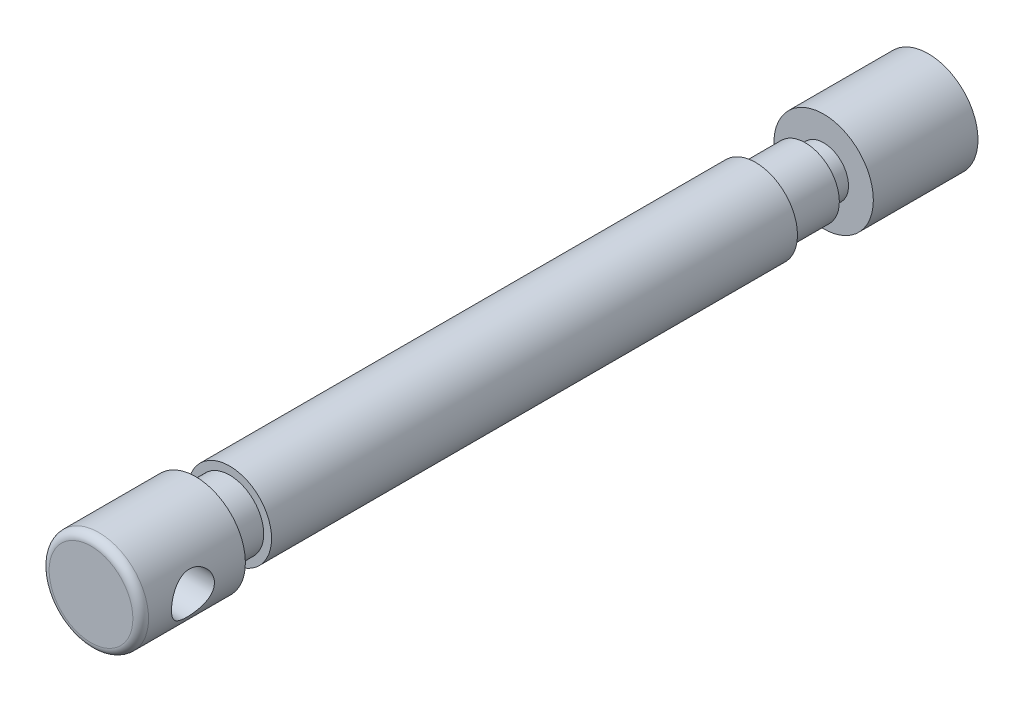
ISO-10303-21;
HEADER;
FILE_DESCRIPTION(('STEP AP214'),'2;1');
FILE_NAME('part.step','',(''),(''),'','','');
FILE_SCHEMA(('AUTOMOTIVE_DESIGN { 1 0 10303 214 1 1 1 1 }'));
ENDSEC;
DATA;
#1=APPLICATION_CONTEXT('core data for automotive mechanical design processes');
#2=APPLICATION_PROTOCOL_DEFINITION('international standard','automotive_design',2000,#1);
#3=PRODUCT_CONTEXT('',#1,'mechanical');
#4=PRODUCT('Part','Part','',(#3));
#5=PRODUCT_RELATED_PRODUCT_CATEGORY('part','',(#4));
#6=PRODUCT_DEFINITION_FORMATION('','',#4);
#7=PRODUCT_DEFINITION_CONTEXT('part definition',#1,'design');
#8=PRODUCT_DEFINITION('design','',#6,#7);
#9=PRODUCT_DEFINITION_SHAPE('','',#8);
#10=(LENGTH_UNIT() NAMED_UNIT(*) SI_UNIT(.MILLI.,.METRE.));
#11=(NAMED_UNIT(*) PLANE_ANGLE_UNIT() SI_UNIT($,.RADIAN.));
#12=(NAMED_UNIT(*) SI_UNIT($,.STERADIAN.) SOLID_ANGLE_UNIT());
#13=UNCERTAINTY_MEASURE_WITH_UNIT(LENGTH_MEASURE(1.E-05),#10,'distance_accuracy_value','');
#14=(GEOMETRIC_REPRESENTATION_CONTEXT(3) GLOBAL_UNCERTAINTY_ASSIGNED_CONTEXT((#13)) GLOBAL_UNIT_ASSIGNED_CONTEXT((#10,
#11,#12)) REPRESENTATION_CONTEXT('',''));
#15=CARTESIAN_POINT('',(0.,0.,0.));
#16=DIRECTION('',(0.,0.,1.));
#17=DIRECTION('',(1.,0.,0.));
#18=AXIS2_PLACEMENT_3D('',#15,#16,#17);
#19=CARTESIAN_POINT('',(0.,0.,20.));
#20=DIRECTION('',(0.,0.,-1.));
#21=DIRECTION('',(-1.,0.,0.));
#22=AXIS2_PLACEMENT_3D('',#19,#20,#21);
#23=CYLINDRICAL_SURFACE('',#22,9.5);
#24=CARTESIAN_POINT('',(0.,0.,20.));
#25=DIRECTION('',(0.,0.,1.));
#26=DIRECTION('',(1.,0.,0.));
#27=AXIS2_PLACEMENT_3D('',#24,#25,#26);
#28=CIRCLE('',#27,9.5);
#29=CARTESIAN_POINT('',(9.5,0.,20.));
#30=VERTEX_POINT('',#29);
#31=EDGE_CURVE('E163',#30,#30,#28,.T.);
#32=ORIENTED_EDGE('',*,*,#31,.F.);
#33=EDGE_LOOP('',(#32));
#34=FACE_BOUND('',#33,.T.);
#35=CARTESIAN_POINT('',(0.,0.,0.));
#36=DIRECTION('',(0.,0.,1.));
#37=DIRECTION('',(1.,0.,0.));
#38=AXIS2_PLACEMENT_3D('',#35,#36,#37);
#39=CIRCLE('',#38,9.5);
#40=CARTESIAN_POINT('',(9.5,0.,0.));
#41=VERTEX_POINT('',#40);
#42=EDGE_CURVE('E187',#41,#41,#39,.T.);
#43=ORIENTED_EDGE('',*,*,#42,.T.);
#44=EDGE_LOOP('',(#43));
#45=FACE_BOUND('',#44,.T.);
#46=ADVANCED_FACE('F51',(#34,#45),#23,.T.);
#47=CARTESIAN_POINT('',(0.,0.,20.));
#48=DIRECTION('',(0.,0.,1.));
#49=DIRECTION('',(1.,0.,0.));
#50=AXIS2_PLACEMENT_3D('',#47,#48,#49);
#51=PLANE('',#50);
#52=CARTESIAN_POINT('',(0.,0.,20.));
#53=DIRECTION('',(0.,0.,1.));
#54=DIRECTION('',(1.,0.,0.));
#55=AXIS2_PLACEMENT_3D('',#52,#53,#54);
#56=CIRCLE('',#55,4.75);
#57=CARTESIAN_POINT('',(4.75,0.,20.));
#58=VERTEX_POINT('',#57);
#59=EDGE_CURVE('E155',#58,#58,#56,.T.);
#60=ORIENTED_EDGE('',*,*,#59,.F.);
#61=EDGE_LOOP('',(#60));
#62=FACE_BOUND('',#61,.T.);
#63=ORIENTED_EDGE('',*,*,#31,.T.);
#64=EDGE_LOOP('',(#63));
#65=FACE_BOUND('',#64,.T.);
#66=ADVANCED_FACE('F106',(#62,#65),#51,.T.);
#67=CARTESIAN_POINT('',(0.,0.,0.));
#68=DIRECTION('',(0.,0.,1.));
#69=DIRECTION('',(1.,0.,0.));
#70=AXIS2_PLACEMENT_3D('',#67,#68,#69);
#71=PLANE('',#70);
#72=ORIENTED_EDGE('',*,*,#42,.F.);
#73=EDGE_LOOP('',(#72));
#74=FACE_BOUND('',#73,.T.);
#75=ADVANCED_FACE('F112',(#74),#71,.F.);
#76=CARTESIAN_POINT('',(0.,0.,23.5));
#77=DIRECTION('',(0.,0.,-1.));
#78=DIRECTION('',(-1.,0.,0.));
#79=AXIS2_PLACEMENT_3D('',#76,#77,#78);
#80=CYLINDRICAL_SURFACE('',#79,4.75);
#81=CARTESIAN_POINT('',(0.,0.,23.5));
#82=DIRECTION('',(0.,0.,1.));
#83=DIRECTION('',(1.,0.,0.));
#84=AXIS2_PLACEMENT_3D('',#81,#82,#83);
#85=CIRCLE('',#84,4.75);
#86=CARTESIAN_POINT('',(4.75,0.,23.5));
#87=VERTEX_POINT('',#86);
#88=EDGE_CURVE('E181',#87,#87,#85,.T.);
#89=ORIENTED_EDGE('',*,*,#88,.F.);
#90=EDGE_LOOP('',(#89));
#91=FACE_BOUND('',#90,.T.);
#92=ORIENTED_EDGE('',*,*,#59,.T.);
#93=EDGE_LOOP('',(#92));
#94=FACE_BOUND('',#93,.T.);
#95=ADVANCED_FACE('F118',(#91,#94),#80,.T.);
#96=CARTESIAN_POINT('',(0.,0.,33.));
#97=DIRECTION('',(0.,0.,-1.));
#98=DIRECTION('',(-1.,0.,0.));
#99=AXIS2_PLACEMENT_3D('',#96,#97,#98);
#100=CYLINDRICAL_SURFACE('',#99,6.5);
#101=CARTESIAN_POINT('',(0.,0.,33.));
#102=DIRECTION('',(0.,0.,1.));
#103=DIRECTION('',(1.,0.,0.));
#104=AXIS2_PLACEMENT_3D('',#101,#102,#103);
#105=CIRCLE('',#104,6.5);
#106=CARTESIAN_POINT('',(6.5,0.,33.));
#107=VERTEX_POINT('',#106);
#108=EDGE_CURVE('E177',#107,#107,#105,.T.);
#109=ORIENTED_EDGE('',*,*,#108,.F.);
#110=EDGE_LOOP('',(#109));
#111=FACE_BOUND('',#110,.T.);
#112=CARTESIAN_POINT('',(0.,0.,23.5));
#113=DIRECTION('',(0.,0.,1.));
#114=DIRECTION('',(1.,0.,0.));
#115=AXIS2_PLACEMENT_3D('',#112,#113,#114);
#116=CIRCLE('',#115,6.5);
#117=CARTESIAN_POINT('',(6.5,0.,23.5));
#118=VERTEX_POINT('',#117);
#119=EDGE_CURVE('E172',#118,#118,#116,.T.);
#120=ORIENTED_EDGE('',*,*,#119,.T.);
#121=EDGE_LOOP('',(#120));
#122=FACE_BOUND('',#121,.T.);
#123=ADVANCED_FACE('F123',(#111,#122),#100,.T.);
#124=CARTESIAN_POINT('',(0.,0.,23.5));
#125=DIRECTION('',(0.,0.,1.));
#126=DIRECTION('',(1.,0.,0.));
#127=AXIS2_PLACEMENT_3D('',#124,#125,#126);
#128=PLANE('',#127);
#129=ORIENTED_EDGE('',*,*,#88,.T.);
#130=EDGE_LOOP('',(#129));
#131=FACE_BOUND('',#130,.T.);
#132=ORIENTED_EDGE('',*,*,#119,.F.);
#133=EDGE_LOOP('',(#132));
#134=FACE_BOUND('',#133,.T.);
#135=ADVANCED_FACE('F127',(#131,#134),#128,.F.);
#136=CARTESIAN_POINT('',(0.,0.,133.5));
#137=DIRECTION('',(0.,0.,-1.));
#138=DIRECTION('',(-1.,0.,0.));
#139=AXIS2_PLACEMENT_3D('',#136,#137,#138);
#140=CYLINDRICAL_SURFACE('',#139,8.);
#141=CARTESIAN_POINT('',(0.,0.,133.5));
#142=DIRECTION('',(0.,0.,1.));
#143=DIRECTION('',(1.,0.,0.));
#144=AXIS2_PLACEMENT_3D('',#141,#142,#143);
#145=CIRCLE('',#144,8.);
#146=CARTESIAN_POINT('',(8.,0.,133.5));
#147=VERTEX_POINT('',#146);
#148=EDGE_CURVE('E168',#147,#147,#145,.T.);
#149=ORIENTED_EDGE('',*,*,#148,.F.);
#150=EDGE_LOOP('',(#149));
#151=FACE_BOUND('',#150,.T.);
#152=CARTESIAN_POINT('',(0.,0.,33.));
#153=DIRECTION('',(0.,0.,1.));
#154=DIRECTION('',(1.,0.,0.));
#155=AXIS2_PLACEMENT_3D('',#152,#153,#154);
#156=CIRCLE('',#155,8.);
#157=CARTESIAN_POINT('',(8.,0.,33.));
#158=VERTEX_POINT('',#157);
#159=EDGE_CURVE('E173',#158,#158,#156,.T.);
#160=ORIENTED_EDGE('',*,*,#159,.T.);
#161=EDGE_LOOP('',(#160));
#162=FACE_BOUND('',#161,.T.);
#163=ADVANCED_FACE('F131',(#151,#162),#140,.T.);
#164=CARTESIAN_POINT('',(0.,0.,133.5));
#165=DIRECTION('',(0.,0.,1.));
#166=DIRECTION('',(1.,0.,0.));
#167=AXIS2_PLACEMENT_3D('',#164,#165,#166);
#168=PLANE('',#167);
#169=CARTESIAN_POINT('',(0.,0.,133.5));
#170=DIRECTION('',(0.,0.,1.));
#171=DIRECTION('',(1.,0.,0.));
#172=AXIS2_PLACEMENT_3D('',#169,#170,#171);
#173=CIRCLE('',#172,6.5);
#174=CARTESIAN_POINT('',(-6.5,0.,133.5));
#175=VERTEX_POINT('',#174);
#176=EDGE_CURVE('E153',#175,#175,#173,.T.);
#177=ORIENTED_EDGE('',*,*,#176,.F.);
#178=EDGE_LOOP('',(#177));
#179=FACE_BOUND('',#178,.T.);
#180=ORIENTED_EDGE('',*,*,#148,.T.);
#181=EDGE_LOOP('',(#180));
#182=FACE_BOUND('',#181,.T.);
#183=ADVANCED_FACE('F135',(#179,#182),#168,.T.);
#184=CARTESIAN_POINT('',(0.,0.,33.));
#185=DIRECTION('',(0.,0.,1.));
#186=DIRECTION('',(1.,0.,0.));
#187=AXIS2_PLACEMENT_3D('',#184,#185,#186);
#188=PLANE('',#187);
#189=ORIENTED_EDGE('',*,*,#108,.T.);
#190=EDGE_LOOP('',(#189));
#191=FACE_BOUND('',#190,.T.);
#192=ORIENTED_EDGE('',*,*,#159,.F.);
#193=EDGE_LOOP('',(#192));
#194=FACE_BOUND('',#193,.T.);
#195=ADVANCED_FACE('F137',(#191,#194),#188,.F.);
#196=CARTESIAN_POINT('',(0.,0.,140.));
#197=DIRECTION('',(0.,0.,-1.));
#198=DIRECTION('',(-1.,0.,0.));
#199=AXIS2_PLACEMENT_3D('',#196,#197,#198);
#200=CYLINDRICAL_SURFACE('',#199,6.5);
#201=CARTESIAN_POINT('',(0.,0.,140.));
#202=DIRECTION('',(0.,0.,1.));
#203=DIRECTION('',(1.,0.,0.));
#204=AXIS2_PLACEMENT_3D('',#201,#202,#203);
#205=CIRCLE('',#204,6.5);
#206=CARTESIAN_POINT('',(-6.5,0.,140.));
#207=VERTEX_POINT('',#206);
#208=EDGE_CURVE('E150',#207,#207,#205,.T.);
#209=CARTESIAN_POINT('',(-6.5,0.,140.));
#210=CARTESIAN_POINT('',(-6.5,0.,139.932291666667));
#211=CARTESIAN_POINT('',(-6.5,0.,139.864583333333));
#212=CARTESIAN_POINT('',(-6.5,0.,139.729166666667));
#213=CARTESIAN_POINT('',(-6.5,0.,139.661458333333));
#214=CARTESIAN_POINT('',(-6.5,0.,139.526041666667));
#215=CARTESIAN_POINT('',(-6.5,0.,139.458333333333));
#216=CARTESIAN_POINT('',(-6.5,0.,139.322916666667));
#217=CARTESIAN_POINT('',(-6.5,0.,139.255208333333));
#218=CARTESIAN_POINT('',(-6.5,0.,139.119791666667));
#219=CARTESIAN_POINT('',(-6.5,0.,139.052083333333));
#220=CARTESIAN_POINT('',(-6.5,0.,138.916666666667));
#221=CARTESIAN_POINT('',(-6.5,0.,138.848958333333));
#222=CARTESIAN_POINT('',(-6.5,0.,138.713541666667));
#223=CARTESIAN_POINT('',(-6.5,0.,138.645833333333));
#224=CARTESIAN_POINT('',(-6.5,0.,138.510416666667));
#225=CARTESIAN_POINT('',(-6.5,0.,138.442708333333));
#226=CARTESIAN_POINT('',(-6.5,0.,138.307291666667));
#227=CARTESIAN_POINT('',(-6.5,0.,138.239583333333));
#228=CARTESIAN_POINT('',(-6.5,0.,138.104166666667));
#229=CARTESIAN_POINT('',(-6.5,0.,138.036458333333));
#230=CARTESIAN_POINT('',(-6.5,0.,137.901041666667));
#231=CARTESIAN_POINT('',(-6.5,0.,137.833333333333));
#232=CARTESIAN_POINT('',(-6.5,0.,137.697916666667));
#233=CARTESIAN_POINT('',(-6.5,0.,137.630208333333));
#234=CARTESIAN_POINT('',(-6.5,0.,137.494791666667));
#235=CARTESIAN_POINT('',(-6.5,0.,137.427083333333));
#236=CARTESIAN_POINT('',(-6.5,0.,137.291666666667));
#237=CARTESIAN_POINT('',(-6.5,0.,137.223958333333));
#238=CARTESIAN_POINT('',(-6.5,0.,137.088541666667));
#239=CARTESIAN_POINT('',(-6.5,0.,137.020833333333));
#240=CARTESIAN_POINT('',(-6.5,0.,136.885416666667));
#241=CARTESIAN_POINT('',(-6.5,0.,136.817708333333));
#242=CARTESIAN_POINT('',(-6.5,0.,136.682291666667));
#243=CARTESIAN_POINT('',(-6.5,0.,136.614583333333));
#244=CARTESIAN_POINT('',(-6.5,0.,136.479166666667));
#245=CARTESIAN_POINT('',(-6.5,0.,136.411458333333));
#246=CARTESIAN_POINT('',(-6.5,0.,136.276041666667));
#247=CARTESIAN_POINT('',(-6.5,0.,136.208333333333));
#248=CARTESIAN_POINT('',(-6.5,0.,136.072916666667));
#249=CARTESIAN_POINT('',(-6.5,0.,136.005208333333));
#250=CARTESIAN_POINT('',(-6.5,0.,135.869791666667));
#251=CARTESIAN_POINT('',(-6.5,0.,135.802083333333));
#252=CARTESIAN_POINT('',(-6.5,0.,135.666666666667));
#253=CARTESIAN_POINT('',(-6.5,0.,135.598958333333));
#254=CARTESIAN_POINT('',(-6.5,0.,135.463541666667));
#255=CARTESIAN_POINT('',(-6.5,0.,135.395833333333));
#256=CARTESIAN_POINT('',(-6.5,0.,135.260416666667));
#257=CARTESIAN_POINT('',(-6.5,0.,135.192708333333));
#258=CARTESIAN_POINT('',(-6.5,0.,135.057291666667));
#259=CARTESIAN_POINT('',(-6.5,0.,134.989583333333));
#260=CARTESIAN_POINT('',(-6.5,0.,134.854166666667));
#261=CARTESIAN_POINT('',(-6.5,0.,134.786458333333));
#262=CARTESIAN_POINT('',(-6.5,0.,134.651041666667));
#263=CARTESIAN_POINT('',(-6.5,0.,134.583333333333));
#264=CARTESIAN_POINT('',(-6.5,0.,134.447916666667));
#265=CARTESIAN_POINT('',(-6.5,0.,134.380208333333));
#266=CARTESIAN_POINT('',(-6.5,0.,134.244791666667));
#267=CARTESIAN_POINT('',(-6.5,0.,134.177083333333));
#268=CARTESIAN_POINT('',(-6.5,0.,134.041666666667));
#269=CARTESIAN_POINT('',(-6.5,0.,133.973958333333));
#270=CARTESIAN_POINT('',(-6.5,0.,133.838541666667));
#271=CARTESIAN_POINT('',(-6.5,0.,133.770833333333));
#272=CARTESIAN_POINT('',(-6.5,0.,133.635416666667));
#273=CARTESIAN_POINT('',(-6.5,0.,133.567708333333));
#274=CARTESIAN_POINT('',(-6.5,0.,133.5));
#275=B_SPLINE_CURVE_WITH_KNOTS('',3,(#209,#210,#211,#212,#213,#214,#215,#216,#217,#218,#219,
#220,#221,#222,#223,#224,#225,#226,#227,#228,#229,#230,#231,#232,#233,#234,#235,#236,#237,#238,
#239,#240,#241,#242,#243,#244,#245,#246,#247,#248,#249,#250,#251,#252,#253,#254,#255,#256,#257,
#258,#259,#260,#261,#262,#263,#264,#265,#266,#267,#268,#269,#270,#271,#272,#273,#274),
.UNSPECIFIED.,.F.,.F.,(4,2,2,2,2,2,2,2,2,2,2,2,2,2,2,2,2,2,2,2,2,2,2,2,2,2,2,2,2,2,2,2,4),(0.,
0.203125000000026,0.406250000000025,0.609375000000023,0.812500000000022,1.01562500000002,
1.21875000000002,1.42187500000002,1.62500000000002,1.82812500000001,2.03125000000001,
2.23437500000001,2.43750000000001,2.64062500000001,2.84375000000001,3.046875,3.25000000000003,
3.45312500000003,3.65625000000003,3.85937500000003,4.06250000000002,4.26562500000002,
4.46875000000002,4.67187500000002,4.87500000000002,5.07812500000002,5.28125000000002,
5.48437500000001,5.68750000000001,5.89062500000001,6.09375000000001,6.29687500000001,
6.50000000000003),.UNSPECIFIED.);
#276=EDGE_CURVE('BSEAM140',#207,#175,#275,.T.);
#277=ORIENTED_EDGE('',*,*,#208,.F.);
#278=ORIENTED_EDGE('',*,*,#176,.T.);
#279=ORIENTED_EDGE('',*,*,#276,.T.);
#280=ORIENTED_EDGE('',*,*,#276,.F.);
#281=EDGE_LOOP('',(#277,#279,#278,#280));
#282=FACE_BOUND('',#281,.T.);
#283=ADVANCED_FACE('F140',(#282),#200,.T.);
#284=CARTESIAN_POINT('',(0.,0.,160.));
#285=DIRECTION('',(0.,0.,-1.));
#286=DIRECTION('',(-1.,0.,0.));
#287=AXIS2_PLACEMENT_3D('',#284,#285,#286);
#288=CYLINDRICAL_SURFACE('',#287,9.5);
#289=CARTESIAN_POINT('',(0.,0.,158.5));
#290=DIRECTION('',(0.,0.,1.));
#291=DIRECTION('',(1.,0.,0.));
#292=AXIS2_PLACEMENT_3D('',#289,#290,#291);
#293=CIRCLE('',#292,9.5);
#294=CARTESIAN_POINT('',(9.5,0.,158.5));
#295=VERTEX_POINT('',#294);
#296=EDGE_CURVE('E10',#295,#295,#293,.F.);
#297=ORIENTED_EDGE('',*,*,#296,.T.);
#298=EDGE_LOOP('',(#297));
#299=FACE_BOUND('',#298,.T.);
#300=CARTESIAN_POINT('',(-9.5,0.,154.069397989875));
#301=CARTESIAN_POINT('',(-9.49999935884308,-0.10776851646045,154.082638534252));
#302=CARTESIAN_POINT('',(-9.49816143005689,-0.216091868803608,154.091597679549));
#303=CARTESIAN_POINT('',(-9.49074707277476,-0.43302590287493,154.100891665626));
#304=CARTESIAN_POINT('',(-9.48516854848051,-0.541636711662345,154.101221667481));
#305=CARTESIAN_POINT('',(-9.47029710168875,-0.758487134502157,154.093284157161));
#306=CARTESIAN_POINT('',(-9.46099752680529,-0.86672573169198,154.085001204367));
#307=CARTESIAN_POINT('',(-9.43881530131106,-1.08188276338633,154.05994458595));
#308=CARTESIAN_POINT('',(-9.42593121939553,-1.18880065267978,154.043167526406));
#309=CARTESIAN_POINT('',(-9.39685385266643,-1.40016870062936,154.001406829398));
#310=CARTESIAN_POINT('',(-9.38067232513897,-1.50462619531813,153.976452162706));
#311=CARTESIAN_POINT('',(-9.34527235427818,-1.7108047062227,153.918601094416));
#312=CARTESIAN_POINT('',(-9.32605277196621,-1.81252467932624,153.885701711862));
#313=CARTESIAN_POINT('',(-9.26438529586967,-2.11250585014553,153.775592990291));
#314=CARTESIAN_POINT('',(-9.21788994913161,-2.30586065971062,153.686918408645));
#315=CARTESIAN_POINT('',(-9.11538466509298,-2.68323974677819,153.477380079274));
#316=CARTESIAN_POINT('',(-9.05904449058063,-2.86647128612331,153.355264430833));
#317=CARTESIAN_POINT('',(-8.94288826723685,-3.21056886570003,153.083964039928));
#318=CARTESIAN_POINT('',(-8.88307004042214,-3.37142067296331,152.934762209052));
#319=CARTESIAN_POINT('',(-8.76026636513518,-3.6793126830389,152.599578872451));
#320=CARTESIAN_POINT('',(-8.69740406646511,-3.82425767600155,152.411622868003));
#321=CARTESIAN_POINT('',(-8.58013918184288,-4.08058256863677,152.011405643465));
#322=CARTESIAN_POINT('',(-8.52573608700428,-4.19196448776577,151.799145886769));
#323=CARTESIAN_POINT('',(-8.4561758909599,-4.32962456462276,151.468969111945));
#324=CARTESIAN_POINT('',(-8.43514981166937,-4.37034181146328,151.358117727022));
#325=CARTESIAN_POINT('',(-8.39752076912347,-4.44221747163925,151.132648716127));
#326=CARTESIAN_POINT('',(-8.38091551674832,-4.47338083328195,151.018033073977));
#327=CARTESIAN_POINT('',(-8.35277739535138,-4.52570364907938,150.786031072397));
#328=CARTESIAN_POINT('',(-8.34124036336882,-4.54687131462497,150.668647070688));
#329=CARTESIAN_POINT('',(-8.32369343340036,-4.5789153120844,150.432076191155));
#330=CARTESIAN_POINT('',(-8.31768279467889,-4.58979302322805,150.312889557126));
#331=CARTESIAN_POINT('',(-8.31180919377774,-4.60041905604755,150.087886202143));
#332=CARTESIAN_POINT('',(-8.31130859385853,-4.6013217686184,149.982138707281));
#333=CARTESIAN_POINT('',(-8.31482784526455,-4.59495938810822,149.770929721704));
#334=CARTESIAN_POINT('',(-8.3188491427911,-4.58769168194944,149.665468333308));
#335=CARTESIAN_POINT('',(-8.33127949901119,-4.56507927613359,149.455711031565));
#336=CARTESIAN_POINT('',(-8.33968708397935,-4.54973728929592,149.351414738778));
#337=CARTESIAN_POINT('',(-8.36060821348223,-4.51117530135737,149.144694234611));
#338=CARTESIAN_POINT('',(-8.37312335936121,-4.4879522276722,149.042270769825));
#339=CARTESIAN_POINT('',(-8.41530016491687,-4.40865967279433,148.745727243138));
#340=CARTESIAN_POINT('',(-8.45007758775074,-4.34213904218598,148.555014327455));
#341=CARTESIAN_POINT('',(-8.52997576869224,-4.18298781771847,148.187307693804));
#342=CARTESIAN_POINT('',(-8.57509979428578,-4.09034897352847,148.010318333452));
#343=CARTESIAN_POINT('',(-8.67651478580859,-3.87092721695145,147.655974508474));
#344=CARTESIAN_POINT('',(-8.73347070944845,-3.74165988999536,147.480345362871));
#345=CARTESIAN_POINT('',(-8.84982154871327,-3.45749515878469,147.152115462967));
#346=CARTESIAN_POINT('',(-8.90921787936555,-3.30258272237697,146.999528315884));
#347=CARTESIAN_POINT('',(-9.03090694083456,-2.95458554500431,146.707415439768));
#348=CARTESIAN_POINT('',(-9.09296533897795,-2.75930246590865,146.570372970651));
#349=CARTESIAN_POINT('',(-9.17939604823961,-2.44954627674912,146.391182913199));
#350=CARTESIAN_POINT('',(-9.20710966116072,-2.34342853380648,146.335826274718));
#351=CARTESIAN_POINT('',(-9.25968475581154,-2.12619158366794,146.234386631164));
#352=CARTESIAN_POINT('',(-9.28454763268167,-2.01507486034992,146.188299081431));
#353=CARTESIAN_POINT('',(-9.33022078248896,-1.79155167469283,146.106971389059));
#354=CARTESIAN_POINT('',(-9.35112009653478,-1.67925509691715,146.071478896071));
#355=CARTESIAN_POINT('',(-9.38917158191892,-1.45147450091312,146.010188489814));
#356=CARTESIAN_POINT('',(-9.40632549303237,-1.33599199077972,145.984386071387));
#357=CARTESIAN_POINT('',(-9.4365133655228,-1.10274205937706,145.942817365994));
#358=CARTESIAN_POINT('',(-9.44954872251155,-0.984975426493336,145.927047677501));
#359=CARTESIAN_POINT('',(-9.47124350085783,-0.748120543386511,145.905788169656));
#360=CARTESIAN_POINT('',(-9.47990328130845,-0.629032402436429,145.90029750663));
#361=CARTESIAN_POINT('',(-9.49216842797922,-0.400821413280239,145.899750495557));
#362=CARTESIAN_POINT('',(-9.49614348937199,-0.291719572106365,145.903839897709));
#363=CARTESIAN_POINT('',(-9.50033485351013,-0.0740816991942165,145.920721766997));
#364=CARTESIAN_POINT('',(-9.5005499195047,0.0344541346361904,145.933517096279));
#365=CARTESIAN_POINT('',(-9.49731978230594,0.250057388702294,145.967715704076));
#366=CARTESIAN_POINT('',(-9.49387630960996,0.357125478930727,145.989114909962));
#367=CARTESIAN_POINT('',(-9.48353547626678,0.569072087073041,146.040329089844));
#368=CARTESIAN_POINT('',(-9.47663681186451,0.673949762900347,146.070147238724));
#369=CARTESIAN_POINT('',(-9.45156859867163,0.979110868842054,146.170221852541));
#370=CARTESIAN_POINT('',(-9.42891747643738,1.17539338525567,146.251986292793));
#371=CARTESIAN_POINT('',(-9.37432661556891,1.55187845412962,146.444080199595));
#372=CARTESIAN_POINT('',(-9.34238476752452,1.73207734273149,146.55441615253));
#373=CARTESIAN_POINT('',(-9.27081860813608,2.08220518358706,146.807600986866));
#374=CARTESIAN_POINT('',(-9.23086635875475,2.25100946108805,146.951914229535));
#375=CARTESIAN_POINT('',(-9.14915400381763,2.56301707907681,147.265603999436));
#376=CARTESIAN_POINT('',(-9.10739309642517,2.70620891739955,147.434991725151));
#377=CARTESIAN_POINT('',(-9.02461896388282,2.97095575034929,147.805216095209));
#378=CARTESIAN_POINT('',(-8.98377775652226,3.09085569274707,148.007280799427));
#379=CARTESIAN_POINT('',(-8.91099065420026,3.29485205921531,148.430231161633));
#380=CARTESIAN_POINT('',(-8.87904206679365,3.37895932443,148.651111096368));
#381=CARTESIAN_POINT('',(-8.82947913540982,3.50640759171999,149.099214886704));
#382=CARTESIAN_POINT('',(-8.81149055202426,3.55081815490823,149.326091025652));
#383=CARTESIAN_POINT('',(-8.79117793962586,3.60082934200968,149.784727811033));
#384=CARTESIAN_POINT('',(-8.78884614121529,3.60644921514337,150.01648597756));
#385=CARTESIAN_POINT('',(-8.7998091698711,3.57959380060987,150.461974529957));
#386=CARTESIAN_POINT('',(-8.8120840687673,3.54960521224548,150.675886252277));
#387=CARTESIAN_POINT('',(-8.84889377346923,3.45681053657273,151.095358186422));
#388=CARTESIAN_POINT('',(-8.87343066557108,3.39399886455319,151.300916970614));
#389=CARTESIAN_POINT('',(-8.93201584639429,3.23669299011321,151.701174021445));
#390=CARTESIAN_POINT('',(-8.96618423029821,3.14179551913812,151.89569527645));
#391=CARTESIAN_POINT('',(-9.03980773094218,2.92320682879648,152.266724913089));
#392=CARTESIAN_POINT('',(-9.07926427951708,2.79950780434809,152.443228393311));
#393=CARTESIAN_POINT('',(-9.16185205296572,2.516672315052,152.78612084913));
#394=CARTESIAN_POINT('',(-9.20504830543693,2.35567269701163,152.950958581002));
#395=CARTESIAN_POINT('',(-9.28719112969979,2.00747760559421,153.251993839693));
#396=CARTESIAN_POINT('',(-9.32613489293183,1.82026500386484,153.388172492993));
#397=CARTESIAN_POINT('',(-9.3777963533445,1.52228335721198,153.568492271109));
#398=CARTESIAN_POINT('',(-9.39397574667628,1.41935178322545,153.624901097114));
#399=CARTESIAN_POINT('',(-9.42339172945028,1.20870477897409,153.728819430793));
#400=CARTESIAN_POINT('',(-9.43662964437632,1.10099152977983,153.77633294533));
#401=CARTESIAN_POINT('',(-9.45962494086419,0.881825324936263,153.861913165601));
#402=CARTESIAN_POINT('',(-9.46939059462032,0.770381958987307,153.900002256952));
#403=CARTESIAN_POINT('',(-9.4850618274982,0.54443110832143,153.966486189854));
#404=CARTESIAN_POINT('',(-9.49097007987195,0.429925802994575,153.994887738524));
#405=CARTESIAN_POINT('',(-9.49651969911233,0.262355527910247,154.028850447055));
#406=CARTESIAN_POINT('',(-9.49782066502459,0.210119915227416,154.038384475761));
#407=CARTESIAN_POINT('',(-9.49956099618662,0.105300468671028,154.055419896325));
#408=CARTESIAN_POINT('',(-9.5000003136317,0.0527166156393061,154.062921175387));
#409=CARTESIAN_POINT('',(-9.5,0.,154.069397989875));
#410=B_SPLINE_CURVE_WITH_KNOTS('',3,(#300,#301,#302,#303,#304,#305,#306,#307,#308,#309,#310,
#311,#312,#313,#314,#315,#316,#317,#318,#319,#320,#321,#322,#323,#324,#325,#326,#327,#328,#329,
#330,#331,#332,#333,#334,#335,#336,#337,#338,#339,#340,#341,#342,#343,#344,#345,#346,#347,#348,
#349,#350,#351,#352,#353,#354,#355,#356,#357,#358,#359,#360,#361,#362,#363,#364,#365,#366,#367,
#368,#369,#370,#371,#372,#373,#374,#375,#376,#377,#378,#379,#380,#381,#382,#383,#384,#385,#386,
#387,#388,#389,#390,#391,#392,#393,#394,#395,#396,#397,#398,#399,#400,#401,#402,#403,#404,#405,
#406,#407,#408,#409),.UNSPECIFIED.,.T.,.F.,(4,2,2,2,2,2,2,2,2,2,2,2,2,2,2,2,2,2,2,2,2,2,2,2,2,2,
2,2,2,2,2,2,2,2,2,2,2,2,2,2,2,2,2,2,2,2,2,2,2,2,2,2,2,2,4),(0.,0.32568413278882,
0.651550894045603,0.978002852109264,1.30458535100218,1.63002315434528,1.95558325623883,
2.60587196570324,3.2849669587116,3.9644918846194,4.69770303819439,5.43087006637772,
5.79029202075336,6.14952750159549,6.50846735752197,6.86735909557429,7.18421210540331,
7.50116648055792,7.81801443241582,8.1349860553636,8.7470583020709,9.35932410976886,
10.0326753971719,10.7064227832468,11.441992836407,11.8101664420926,12.1781590887856,
12.5365197260458,12.8947135455756,13.252785857174,13.6108287778607,13.9381740260974,
14.2656269438495,14.5929250445304,14.9203467384684,15.5587694703702,16.1973372660753,
16.8713378883575,17.5456404384616,18.2576025585099,18.9693488805884,19.6612837948184,
20.3528753234096,20.9988792275954,21.6449930824645,22.2995496598092,22.9542838257021,
23.6544412721486,24.3550583763472,24.7101267763144,25.0650348500384,25.4190916466125,
25.7729028139521,25.9322073432233,26.09152071054),.UNSPECIFIED.);
#411=CARTESIAN_POINT('',(-9.5,0.,154.069397989875));
#412=VERTEX_POINT('',#411);
#413=EDGE_CURVE('E66',#412,#412,#410,.T.);
#414=ORIENTED_EDGE('',*,*,#413,.T.);
#415=EDGE_LOOP('',(#414));
#416=FACE_BOUND('',#415,.T.);
#417=CARTESIAN_POINT('',(9.48683298050514,-0.5,145.9));
#418=CARTESIAN_POINT('',(9.48098478666746,-0.610948712724445,145.900000837454));
#419=CARTESIAN_POINT('',(9.47318411802209,-0.721831979259303,145.904510022139));
#420=CARTESIAN_POINT('',(9.45377322557197,-0.942585556273259,145.922452026525));
#421=CARTESIAN_POINT('',(9.44216053843029,-1.05245516439902,145.935890622203));
#422=CARTESIAN_POINT('',(9.41529405065131,-1.27056150769333,145.971543226178));
#423=CARTESIAN_POINT('',(9.40003253680757,-1.37879426033728,145.993775890185));
#424=CARTESIAN_POINT('',(9.36617552436772,-1.5926422662012,146.046736812319));
#425=CARTESIAN_POINT('',(9.34757863126464,-1.6982564034863,146.077468626827));
#426=CARTESIAN_POINT('',(9.28749016305577,-2.00917371616281,146.181632060977));
#427=CARTESIAN_POINT('',(9.24155497218812,-2.20969352096013,146.267222354516));
#428=CARTESIAN_POINT('',(9.14145748486379,-2.59289462811766,146.467770879308));
#429=CARTESIAN_POINT('',(9.08729769441407,-2.77558133640025,146.582720172225));
#430=CARTESIAN_POINT('',(8.97158443694942,-3.13008432295578,146.846541400495));
#431=CARTESIAN_POINT('',(8.90978354301033,-3.30063190050683,146.997009225965));
#432=CARTESIAN_POINT('',(8.78698007710232,-3.61489826292995,147.324390343011));
#433=CARTESIAN_POINT('',(8.72597807757005,-3.75859869466593,147.501321577692));
#434=CARTESIAN_POINT('',(8.63814794112624,-3.95447745877099,147.78845070579));
#435=CARTESIAN_POINT('',(8.60883477738635,-4.01773667558861,147.890495140295));
#436=CARTESIAN_POINT('',(8.55297061982769,-4.13532627739437,148.1003041406));
#437=CARTESIAN_POINT('',(8.52641838406139,-4.18966068345981,148.208066101252));
#438=CARTESIAN_POINT('',(8.47695534108172,-4.2888581712962,148.428638529834));
#439=CARTESIAN_POINT('',(8.45404369087625,-4.33372344647431,148.54144782126));
#440=CARTESIAN_POINT('',(8.41270071722921,-4.41344369923594,148.771285681185));
#441=CARTESIAN_POINT('',(8.39426671901196,-4.44830465528163,148.888311682565));
#442=CARTESIAN_POINT('',(8.36379978570373,-4.50530989190174,149.116669166359));
#443=CARTESIAN_POINT('',(8.35138743376843,-4.52821806870238,149.227759464963));
#444=CARTESIAN_POINT('',(8.33146243002729,-4.5647748614275,149.451837021244));
#445=CARTESIAN_POINT('',(8.32394725899082,-4.57842823839488,149.56482327286));
#446=CARTESIAN_POINT('',(8.31409962357499,-4.59628679439172,149.791721884264));
#447=CARTESIAN_POINT('',(8.31176512172745,-4.60049568778162,149.905633862282));
#448=CARTESIAN_POINT('',(8.31236519661672,-4.59941144030153,150.133392934775));
#449=CARTESIAN_POINT('',(8.31529940823767,-4.59411895786611,150.2472400332));
#450=CARTESIAN_POINT('',(8.32574780033323,-4.57515308508837,150.462079243835));
#451=CARTESIAN_POINT('',(8.33275496983554,-4.5624066486992,150.563179073777));
#452=CARTESIAN_POINT('',(8.35068322946589,-4.52950678290567,150.763823949961));
#453=CARTESIAN_POINT('',(8.36160556038065,-4.50935100529296,150.863368492854));
#454=CARTESIAN_POINT('',(8.39978868531146,-4.43807623532326,151.158649327981));
#455=CARTESIAN_POINT('',(8.43247406292871,-4.37613546097238,151.351191010716));
#456=CARTESIAN_POINT('',(8.51005294129724,-4.22332857042551,151.729100223889));
#457=CARTESIAN_POINT('',(8.55530609678168,-4.13159418826195,151.914036253578));
#458=CARTESIAN_POINT('',(8.65314133508159,-3.92255610636109,152.266748795378));
#459=CARTESIAN_POINT('',(8.70572669142177,-3.80524097261155,152.434517584696));
#460=CARTESIAN_POINT('',(8.82017898643633,-3.5325306879461,152.768675884247));
#461=CARTESIAN_POINT('',(8.88241280312596,-3.37428884212616,152.932617868425));
#462=CARTESIAN_POINT('',(9.00490316317016,-3.03226463539069,153.23254064071));
#463=CARTESIAN_POINT('',(9.06515884873935,-2.84847137071892,153.368509429842));
#464=CARTESIAN_POINT('',(9.15137738880535,-2.55217642871445,153.551468375964));
#465=CARTESIAN_POINT('',(9.18000533856183,-2.44740915888239,153.60999492271));
#466=CARTESIAN_POINT('',(9.23459448805177,-2.23260294033196,153.717863629788));
#467=CARTESIAN_POINT('',(9.2605568253117,-2.12256626992793,153.767209715162));
#468=CARTESIAN_POINT('',(9.30919039574556,-1.8979421754093,153.856210038331));
#469=CARTESIAN_POINT('',(9.33186168645488,-1.78335483089601,153.895864445569));
#470=CARTESIAN_POINT('',(9.37335782954879,-1.55052622121497,153.964987877426));
#471=CARTESIAN_POINT('',(9.3921847324843,-1.43228694289764,153.99446233774));
#472=CARTESIAN_POINT('',(9.42444068726151,-1.20108973896497,154.041217295368));
#473=CARTESIAN_POINT('',(9.43814685441319,-1.08830864059219,154.059182400657));
#474=CARTESIAN_POINT('',(9.46156502918689,-0.861278680482382,154.085649330222));
#475=CARTESIAN_POINT('',(9.47127889680943,-0.74703052788523,154.094155564516));
#476=CARTESIAN_POINT('',(9.48656349187246,-0.517964320651073,154.101561471382));
#477=CARTESIAN_POINT('',(9.49213489093773,-0.403146361437831,154.100462701595));
#478=CARTESIAN_POINT('',(9.4991008261344,-0.173885646809339,154.08862137893));
#479=CARTESIAN_POINT('',(9.50049554537925,-0.0594428751649121,154.07787924886));
#480=CARTESIAN_POINT('',(9.49923958432655,0.160089916698137,154.047921765142));
#481=CARTESIAN_POINT('',(9.49686711895202,0.265270591230478,154.029357025627));
#482=CARTESIAN_POINT('',(9.48875499629352,0.473751001805792,153.984119367998));
#483=CARTESIAN_POINT('',(9.4830142347812,0.577050109559321,153.957443792293));
#484=CARTESIAN_POINT('',(9.46107688666387,0.882976507736887,153.865566080166));
#485=CARTESIAN_POINT('',(9.44016324109626,1.08184347844931,153.788483901301));
#486=CARTESIAN_POINT('',(9.38810980258729,1.46691035023555,153.603833642033));
#487=CARTESIAN_POINT('',(9.35682361454342,1.65287993489789,153.495832343426));
#488=CARTESIAN_POINT('',(9.28775292742418,2.00495625400501,153.252838788178));
#489=CARTESIAN_POINT('',(9.24996609025654,2.17105580521481,153.11783681734));
#490=CARTESIAN_POINT('',(9.16930707119223,2.49054242405577,152.813985590082));
#491=CARTESIAN_POINT('',(9.12626382357687,2.64229037498526,152.64345606893));
#492=CARTESIAN_POINT('',(9.0426221950378,2.91572913542696,152.279183477776));
#493=CARTESIAN_POINT('',(9.00202448092695,3.03741177496452,152.085434119189));
#494=CARTESIAN_POINT('',(8.92748485756006,3.25009220466204,151.673863624556));
#495=CARTESIAN_POINT('',(8.89374418078633,3.34020681801637,151.455546421229));
#496=CARTESIAN_POINT('',(8.83926284251255,3.48185018818011,151.005230749761));
#497=CARTESIAN_POINT('',(8.81851404806365,3.53340308865418,150.773240940435));
#498=CARTESIAN_POINT('',(8.79405482082285,3.59382790971633,150.316855670772));
#499=CARTESIAN_POINT('',(8.7894114938697,3.60503819471389,150.092819507035));
#500=CARTESIAN_POINT('',(8.79523608581142,3.59080570972396,149.646138925412));
#501=CARTESIAN_POINT('',(8.80570159942744,3.56536877385756,149.423494291666));
#502=CARTESIAN_POINT('',(8.83945929732908,3.48078668467662,148.995536012));
#503=CARTESIAN_POINT('',(8.86219720611125,3.42309454749934,148.789886928983));
#504=CARTESIAN_POINT('',(8.91720525517901,3.27711799551826,148.391119135347));
#505=CARTESIAN_POINT('',(8.94947796207363,3.1888253424556,148.198003815702));
#506=CARTESIAN_POINT('',(9.02153727957183,2.97904584217414,147.819317257958));
#507=CARTESIAN_POINT('',(9.06161678797185,2.85613201892504,147.634592853515));
#508=CARTESIAN_POINT('',(9.14338419195669,2.58242839049173,147.28751980129));
#509=CARTESIAN_POINT('',(9.18507254414009,2.43163062496666,147.125177566359));
#510=CARTESIAN_POINT('',(9.26759563047405,2.0959639103479,146.817938455263));
#511=CARTESIAN_POINT('',(9.30824745994734,1.90964646262065,146.674555733152));
#512=CARTESIAN_POINT('',(9.36258736016208,1.61311570770763,146.484519612909));
#513=CARTESIAN_POINT('',(9.37960486901796,1.51134493513791,146.425311393831));
#514=CARTESIAN_POINT('',(9.41083932344704,1.30276364071503,146.315723404771));
#515=CARTESIAN_POINT('',(9.42505758604135,1.1959555183533,146.265339484271));
#516=CARTESIAN_POINT('',(9.4498212224653,0.980959296223578,146.175082368471));
#517=CARTESIAN_POINT('',(9.46045426308343,0.872883545359851,146.134965161759));
#518=CARTESIAN_POINT('',(9.47813369009509,0.653512978560776,146.063924621654));
#519=CARTESIAN_POINT('',(9.48518177007193,0.542219708935175,146.032996949879));
#520=CARTESIAN_POINT('',(9.49535697244491,0.317518140829992,145.980678789847));
#521=CARTESIAN_POINT('',(9.49849328785695,0.204115439290398,145.959266017277));
#522=CARTESIAN_POINT('',(9.50065368541036,-0.0240756984273536,145.926086348553));
#523=CARTESIAN_POINT('',(9.49968063653719,-0.138863112046836,145.914312729601));
#524=CARTESIAN_POINT('',(9.49551236015524,-0.294843098228801,145.904929725813));
#525=CARTESIAN_POINT('',(9.49414974823187,-0.335867524915143,145.903080938732));
#526=CARTESIAN_POINT('',(9.49089141202995,-0.417930951589332,145.900615942798));
#527=CARTESIAN_POINT('',(9.48899570663122,-0.45896995100968,145.899999690301));
#528=CARTESIAN_POINT('',(9.48683298050514,-0.5,145.9));
#529=B_SPLINE_CURVE_WITH_KNOTS('',3,(#417,#418,#419,#420,#421,#422,#423,#424,#425,#426,#427,
#428,#429,#430,#431,#432,#433,#434,#435,#436,#437,#438,#439,#440,#441,#442,#443,#444,#445,#446,
#447,#448,#449,#450,#451,#452,#453,#454,#455,#456,#457,#458,#459,#460,#461,#462,#463,#464,#465,
#466,#467,#468,#469,#470,#471,#472,#473,#474,#475,#476,#477,#478,#479,#480,#481,#482,#483,#484,
#485,#486,#487,#488,#489,#490,#491,#492,#493,#494,#495,#496,#497,#498,#499,#500,#501,#502,#503,
#504,#505,#506,#507,#508,#509,#510,#511,#512,#513,#514,#515,#516,#517,#518,#519,#520,#521,#522,
#523,#524,#525,#526,#527,#528),.UNSPECIFIED.,.T.,.F.,(4,2,2,2,2,2,2,2,2,2,2,2,2,2,2,2,2,2,2,2,2,
2,2,2,2,2,2,2,2,2,2,2,2,2,2,2,2,2,2,2,2,2,2,2,2,2,2,2,2,2,2,2,2,2,2,4),(0.,0.333265463658916,
0.666746709728112,1.00093922909206,1.3352717999452,2.00048084575595,2.6654876098606,
3.3695534098402,4.07409877320262,4.44446053360892,4.8146549669201,5.1847635549237,
5.55465050767082,5.89648655260392,6.23814660953131,6.57967227359637,6.92117427123334,
7.22722864330316,7.53338009551635,8.14521165134461,8.77677099472168,9.40861321149979,
10.1142185237117,10.8201258739689,11.1898439714799,11.5594036335203,11.9289568339938,
12.2983124012888,12.6429245814138,12.9873760252435,13.3317716104474,13.6761520964844,
13.996258557991,14.3164700186625,14.9562630694089,15.6055003554133,16.2549716430454,
16.9487287270114,17.6426741263204,18.3547204604197,19.0663206050309,19.7359432971848,
20.405459399313,21.0469977956472,21.6887090410317,22.3621903071173,23.0358641371062,
23.7477933041152,24.1043060942309,24.4606507451966,24.8075131801204,25.1542116000471,
25.5000937012869,25.8457343621143,25.9689839446491,26.0922291627768),.UNSPECIFIED.);
#530=CARTESIAN_POINT('',(9.48683298050514,-0.5,145.9));
#531=VERTEX_POINT('',#530);
#532=EDGE_CURVE('E73',#531,#531,#529,.T.);
#533=ORIENTED_EDGE('',*,*,#532,.T.);
#534=EDGE_LOOP('',(#533));
#535=FACE_BOUND('',#534,.T.);
#536=CARTESIAN_POINT('',(0.,0.,140.));
#537=DIRECTION('',(0.,0.,1.));
#538=DIRECTION('',(1.,0.,0.));
#539=AXIS2_PLACEMENT_3D('',#536,#537,#538);
#540=CIRCLE('',#539,9.5);
#541=CARTESIAN_POINT('',(9.5,0.,140.));
#542=VERTEX_POINT('',#541);
#543=EDGE_CURVE('E212',#542,#542,#540,.T.);
#544=ORIENTED_EDGE('',*,*,#543,.T.);
#545=EDGE_LOOP('',(#544));
#546=FACE_BOUND('',#545,.T.);
#547=ADVANCED_FACE('F85',(#299,#416,#535,#546),#288,.T.);
#548=CARTESIAN_POINT('',(0.,0.,160.));
#549=DIRECTION('',(0.,0.,1.));
#550=DIRECTION('',(1.,0.,0.));
#551=AXIS2_PLACEMENT_3D('',#548,#549,#550);
#552=PLANE('',#551);
#553=CARTESIAN_POINT('',(0.,0.,160.));
#554=DIRECTION('',(0.,0.,1.));
#555=DIRECTION('',(1.,0.,0.));
#556=AXIS2_PLACEMENT_3D('',#553,#554,#555);
#557=CIRCLE('',#556,8.);
#558=CARTESIAN_POINT('',(8.,0.,160.));
#559=VERTEX_POINT('',#558);
#560=EDGE_CURVE('E59',#559,#559,#557,.T.);
#561=ORIENTED_EDGE('',*,*,#560,.T.);
#562=EDGE_LOOP('',(#561));
#563=FACE_BOUND('',#562,.T.);
#564=ADVANCED_FACE('F95',(#563),#552,.T.);
#565=CARTESIAN_POINT('',(0.,0.,140.));
#566=DIRECTION('',(0.,0.,1.));
#567=DIRECTION('',(1.,0.,0.));
#568=AXIS2_PLACEMENT_3D('',#565,#566,#567);
#569=PLANE('',#568);
#570=ORIENTED_EDGE('',*,*,#208,.T.);
#571=EDGE_LOOP('',(#570));
#572=FACE_BOUND('',#571,.T.);
#573=ORIENTED_EDGE('',*,*,#543,.F.);
#574=EDGE_LOOP('',(#573));
#575=FACE_BOUND('',#574,.T.);
#576=ADVANCED_FACE('F93',(#572,#575),#569,.F.);
#577=CARTESIAN_POINT('',(-9.5,-0.5,150.));
#578=DIRECTION('',(1.,0.,0.));
#579=DIRECTION('',(0.,0.,-1.));
#580=AXIS2_PLACEMENT_3D('',#577,#578,#579);
#581=CYLINDRICAL_SURFACE('',#580,4.09999999999999);
#582=ORIENTED_EDGE('',*,*,#532,.F.);
#583=EDGE_LOOP('',(#582));
#584=FACE_BOUND('',#583,.T.);
#585=ORIENTED_EDGE('',*,*,#413,.F.);
#586=EDGE_LOOP('',(#585));
#587=FACE_BOUND('',#586,.T.);
#588=ADVANCED_FACE('F89',(#584,#587),#581,.F.);
#589=CARTESIAN_POINT('',(0.,0.,158.5));
#590=DIRECTION('',(0.,0.,1.));
#591=DIRECTION('',(1.,0.,0.));
#592=AXIS2_PLACEMENT_3D('',#589,#590,#591);
#593=TOROIDAL_SURFACE('',#592,8.,1.5);
#594=ORIENTED_EDGE('',*,*,#296,.F.);
#595=EDGE_LOOP('',(#594));
#596=FACE_BOUND('',#595,.T.);
#597=ORIENTED_EDGE('',*,*,#560,.F.);
#598=EDGE_LOOP('',(#597));
#599=FACE_BOUND('',#598,.T.);
#600=ADVANCED_FACE('F53',(#596,#599),#593,.T.);
#601=CLOSED_SHELL('',(#46,#66,#75,#95,#123,#135,#163,#183,#195,#283,#547,#564,#576,#588,#600));
#602=MANIFOLD_SOLID_BREP('B2',#601);
#603=ADVANCED_BREP_SHAPE_REPRESENTATION('',(#18,#602),#14);
#604=SHAPE_DEFINITION_REPRESENTATION(#9,#603);
ENDSEC;
END-ISO-10303-21;
